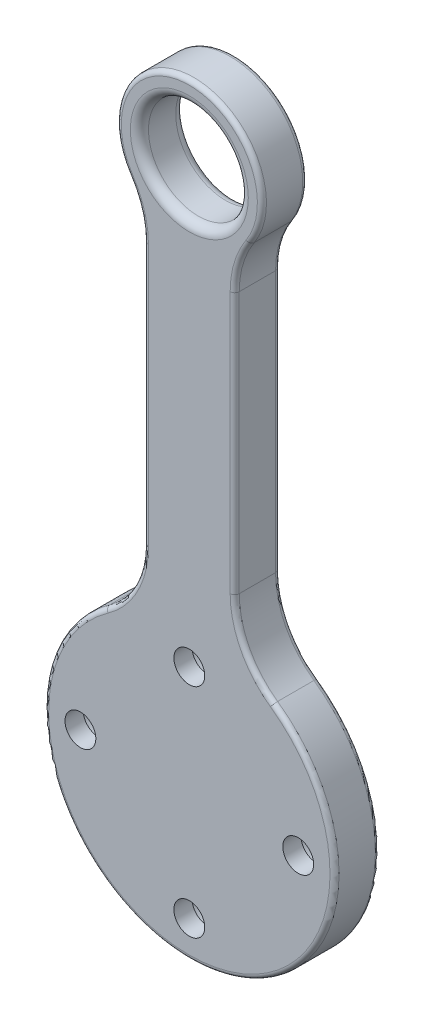
ISO-10303-21;
HEADER;
FILE_DESCRIPTION(('STEP AP214'),'2;1');
FILE_NAME('part.step','',(''),(''),'','','');
FILE_SCHEMA(('AUTOMOTIVE_DESIGN { 1 0 10303 214 1 1 1 1 }'));
ENDSEC;
DATA;
#1=APPLICATION_CONTEXT('core data for automotive mechanical design processes');
#2=APPLICATION_PROTOCOL_DEFINITION('international standard','automotive_design',2000,#1);
#3=PRODUCT_CONTEXT('',#1,'mechanical');
#4=PRODUCT('Part','Part','',(#3));
#5=PRODUCT_RELATED_PRODUCT_CATEGORY('part','',(#4));
#6=PRODUCT_DEFINITION_FORMATION('','',#4);
#7=PRODUCT_DEFINITION_CONTEXT('part definition',#1,'design');
#8=PRODUCT_DEFINITION('design','',#6,#7);
#9=PRODUCT_DEFINITION_SHAPE('','',#8);
#10=(LENGTH_UNIT() NAMED_UNIT(*) SI_UNIT(.MILLI.,.METRE.));
#11=(NAMED_UNIT(*) PLANE_ANGLE_UNIT() SI_UNIT($,.RADIAN.));
#12=(NAMED_UNIT(*) SI_UNIT($,.STERADIAN.) SOLID_ANGLE_UNIT());
#13=UNCERTAINTY_MEASURE_WITH_UNIT(LENGTH_MEASURE(1.E-05),#10,'distance_accuracy_value','');
#14=(GEOMETRIC_REPRESENTATION_CONTEXT(3) GLOBAL_UNCERTAINTY_ASSIGNED_CONTEXT((#13)) GLOBAL_UNIT_ASSIGNED_CONTEXT((#10,
#11,#12)) REPRESENTATION_CONTEXT('',''));
#15=CARTESIAN_POINT('',(0.,0.,0.));
#16=DIRECTION('',(0.,0.,1.));
#17=DIRECTION('',(1.,0.,0.));
#18=AXIS2_PLACEMENT_3D('',#15,#16,#17);
#19=CARTESIAN_POINT('',(0.,60.,0.));
#20=DIRECTION('',(0.,0.,1.));
#21=DIRECTION('',(1.,0.,0.));
#22=AXIS2_PLACEMENT_3D('',#19,#20,#21);
#23=CYLINDRICAL_SURFACE('',#22,8.);
#24=DIRECTION('',(0.,0.,1.));
#25=VECTOR('',#24,1.);
#26=CARTESIAN_POINT('',(6.66666666666667,55.5778336128595,0.));
#27=LINE('',#26,#25);
#28=CARTESIAN_POINT('',(6.66666666666667,55.5778336128595,4.5));
#29=VERTEX_POINT('',#28);
#30=CARTESIAN_POINT('',(6.66666666666667,55.5778336128595,0.5));
#31=VERTEX_POINT('',#30);
#32=EDGE_CURVE('E340',#29,#31,#27,.F.);
#33=ORIENTED_EDGE('',*,*,#32,.T.);
#34=CARTESIAN_POINT('',(0.,60.,0.5));
#35=DIRECTION('',(0.,0.,1.));
#36=DIRECTION('',(1.,0.,0.));
#37=AXIS2_PLACEMENT_3D('',#34,#35,#36);
#38=CIRCLE('',#37,8.);
#39=CARTESIAN_POINT('',(-6.66666666666667,55.5778336128595,0.5));
#40=VERTEX_POINT('',#39);
#41=EDGE_CURVE('E216',#31,#40,#38,.T.);
#42=ORIENTED_EDGE('',*,*,#41,.T.);
#43=DIRECTION('',(0.,0.,1.));
#44=VECTOR('',#43,1.);
#45=CARTESIAN_POINT('',(-6.66666666666667,55.5778336128595,0.));
#46=LINE('',#45,#44);
#47=CARTESIAN_POINT('',(-6.66666666666667,55.5778336128595,4.5));
#48=VERTEX_POINT('',#47);
#49=EDGE_CURVE('E330',#40,#48,#46,.T.);
#50=ORIENTED_EDGE('',*,*,#49,.T.);
#51=CARTESIAN_POINT('',(0.,60.,4.5));
#52=DIRECTION('',(0.,0.,1.));
#53=DIRECTION('',(1.,0.,0.));
#54=AXIS2_PLACEMENT_3D('',#51,#52,#53);
#55=CIRCLE('',#54,8.);
#56=EDGE_CURVE('E213',#48,#29,#55,.F.);
#57=ORIENTED_EDGE('',*,*,#56,.T.);
#58=EDGE_LOOP('',(#33,#42,#50,#57));
#59=FACE_BOUND('',#58,.T.);
#60=ADVANCED_FACE('F42',(#59),#23,.T.);
#61=CARTESIAN_POINT('',(5.,13.076696830622,0.));
#62=DIRECTION('',(1.,0.,0.));
#63=DIRECTION('',(0.,1.,0.));
#64=AXIS2_PLACEMENT_3D('',#61,#62,#63);
#65=PLANE('',#64);
#66=DIRECTION('',(0.,0.,1.));
#67=VECTOR('',#66,1.);
#68=CARTESIAN_POINT('',(5.,21.2367605815953,0.));
#69=LINE('',#68,#67);
#70=CARTESIAN_POINT('',(5.,21.2367605815953,4.5));
#71=VERTEX_POINT('',#70);
#72=CARTESIAN_POINT('',(5.,21.2367605815953,0.5));
#73=VERTEX_POINT('',#72);
#74=EDGE_CURVE('E390',#71,#73,#69,.F.);
#75=ORIENTED_EDGE('',*,*,#74,.T.);
#76=DIRECTION('',(0.,1.,0.));
#77=VECTOR('',#76,1.);
#78=CARTESIAN_POINT('',(5.,50.0501256289338,0.5));
#79=LINE('',#78,#77);
#80=CARTESIAN_POINT('',(5.,50.0501256289338,0.5));
#81=VERTEX_POINT('',#80);
#82=EDGE_CURVE('E204',#73,#81,#79,.T.);
#83=ORIENTED_EDGE('',*,*,#82,.T.);
#84=DIRECTION('',(0.,0.,-1.));
#85=VECTOR('',#84,1.);
#86=CARTESIAN_POINT('',(5.,50.0501256289338,5.));
#87=LINE('',#86,#85);
#88=CARTESIAN_POINT('',(5.,50.0501256289338,4.5));
#89=VERTEX_POINT('',#88);
#90=EDGE_CURVE('E396',#81,#89,#87,.F.);
#91=ORIENTED_EDGE('',*,*,#90,.T.);
#92=DIRECTION('',(0.,1.,0.));
#93=VECTOR('',#92,1.);
#94=CARTESIAN_POINT('',(5.,13.076696830622,4.5));
#95=LINE('',#94,#93);
#96=EDGE_CURVE('E201',#89,#71,#95,.F.);
#97=ORIENTED_EDGE('',*,*,#96,.T.);
#98=EDGE_LOOP('',(#75,#83,#91,#97));
#99=FACE_BOUND('',#98,.T.);
#100=ADVANCED_FACE('F393',(#99),#65,.T.);
#101=CARTESIAN_POINT('',(-5.,53.7550020016016,0.));
#102=DIRECTION('',(-1.,0.,0.));
#103=DIRECTION('',(0.,-1.,0.));
#104=AXIS2_PLACEMENT_3D('',#101,#102,#103);
#105=PLANE('',#104);
#106=DIRECTION('',(0.,0.,-1.));
#107=VECTOR('',#106,1.);
#108=CARTESIAN_POINT('',(-5.,50.0501256289338,0.));
#109=LINE('',#108,#107);
#110=CARTESIAN_POINT('',(-5.,50.0501256289338,4.5));
#111=VERTEX_POINT('',#110);
#112=CARTESIAN_POINT('',(-5.,50.0501256289338,0.5));
#113=VERTEX_POINT('',#112);
#114=EDGE_CURVE('E333',#111,#113,#109,.T.);
#115=ORIENTED_EDGE('',*,*,#114,.T.);
#116=DIRECTION('',(0.,-1.,0.));
#117=VECTOR('',#116,1.);
#118=CARTESIAN_POINT('',(-5.,21.2367605815953,0.5));
#119=LINE('',#118,#117);
#120=CARTESIAN_POINT('',(-5.,21.2367605815953,0.5));
#121=VERTEX_POINT('',#120);
#122=EDGE_CURVE('E228',#113,#121,#119,.T.);
#123=ORIENTED_EDGE('',*,*,#122,.T.);
#124=DIRECTION('',(0.,0.,1.));
#125=VECTOR('',#124,1.);
#126=CARTESIAN_POINT('',(-5.,21.2367605815953,5.));
#127=LINE('',#126,#125);
#128=CARTESIAN_POINT('',(-5.,21.2367605815953,4.5));
#129=VERTEX_POINT('',#128);
#130=EDGE_CURVE('E347',#121,#129,#127,.T.);
#131=ORIENTED_EDGE('',*,*,#130,.T.);
#132=DIRECTION('',(0.,-1.,0.));
#133=VECTOR('',#132,1.);
#134=CARTESIAN_POINT('',(-5.,53.7550020016016,4.5));
#135=LINE('',#134,#133);
#136=EDGE_CURVE('E225',#129,#111,#135,.F.);
#137=ORIENTED_EDGE('',*,*,#136,.T.);
#138=EDGE_LOOP('',(#115,#123,#131,#137));
#139=FACE_BOUND('',#138,.T.);
#140=ADVANCED_FACE('F407',(#139),#105,.T.);
#141=CARTESIAN_POINT('',(0.,60.,0.));
#142=DIRECTION('',(0.,0.,1.));
#143=DIRECTION('',(1.,0.,0.));
#144=AXIS2_PLACEMENT_3D('',#141,#142,#143);
#145=PLANE('',#144);
#146=DIRECTION('',(0.,1.,0.));
#147=VECTOR('',#146,1.);
#148=CARTESIAN_POINT('',(4.5,21.2367605815953,0.));
#149=LINE('',#148,#147);
#150=CARTESIAN_POINT('',(4.5,50.0501256289338,0.));
#151=VERTEX_POINT('',#150);
#152=CARTESIAN_POINT('',(4.5,21.2367605815953,0.));
#153=VERTEX_POINT('',#152);
#154=EDGE_CURVE('E186',#151,#153,#149,.F.);
#155=ORIENTED_EDGE('',*,*,#154,.T.);
#156=CARTESIAN_POINT('',(15.,21.2367605815953,0.));
#157=DIRECTION('',(0.,0.,1.));
#158=DIRECTION('',(1.,0.,0.));
#159=AXIS2_PLACEMENT_3D('',#156,#157,#158);
#160=CIRCLE('',#159,10.5);
#161=CARTESIAN_POINT('',(8.94230769230769,12.6603765005664,0.));
#162=VERTEX_POINT('',#161);
#163=EDGE_CURVE('E164',#153,#162,#160,.T.);
#164=ORIENTED_EDGE('',*,*,#163,.T.);
#165=CARTESIAN_POINT('',(0.,0.,0.));
#166=DIRECTION('',(0.,0.,1.));
#167=DIRECTION('',(1.,0.,0.));
#168=AXIS2_PLACEMENT_3D('',#165,#166,#167);
#169=CIRCLE('',#168,15.5);
#170=CARTESIAN_POINT('',(-8.94230769230769,12.6603765005664,0.));
#171=VERTEX_POINT('',#170);
#172=EDGE_CURVE('E173',#162,#171,#169,.F.);
#173=ORIENTED_EDGE('',*,*,#172,.T.);
#174=CARTESIAN_POINT('',(-15.,21.2367605815953,0.));
#175=DIRECTION('',(0.,0.,1.));
#176=DIRECTION('',(1.,0.,0.));
#177=AXIS2_PLACEMENT_3D('',#174,#175,#176);
#178=CIRCLE('',#177,10.5);
#179=CARTESIAN_POINT('',(-4.5,21.2367605815953,0.));
#180=VERTEX_POINT('',#179);
#181=EDGE_CURVE('E180',#171,#180,#178,.T.);
#182=ORIENTED_EDGE('',*,*,#181,.T.);
#183=DIRECTION('',(0.,-1.,0.));
#184=VECTOR('',#183,1.);
#185=CARTESIAN_POINT('',(-4.5,50.0501256289338,0.));
#186=LINE('',#185,#184);
#187=CARTESIAN_POINT('',(-4.5,50.0501256289338,0.));
#188=VERTEX_POINT('',#187);
#189=EDGE_CURVE('E363',#180,#188,#186,.F.);
#190=ORIENTED_EDGE('',*,*,#189,.T.);
#191=CARTESIAN_POINT('',(-15.,50.0501256289338,0.));
#192=DIRECTION('',(0.,0.,1.));
#193=DIRECTION('',(1.,0.,0.));
#194=AXIS2_PLACEMENT_3D('',#191,#192,#193);
#195=CIRCLE('',#194,10.5);
#196=CARTESIAN_POINT('',(-6.25,55.8542190120558,0.));
#197=VERTEX_POINT('',#196);
#198=EDGE_CURVE('E366',#188,#197,#195,.T.);
#199=ORIENTED_EDGE('',*,*,#198,.T.);
#200=CARTESIAN_POINT('',(0.,60.,0.));
#201=DIRECTION('',(0.,0.,1.));
#202=DIRECTION('',(1.,0.,0.));
#203=AXIS2_PLACEMENT_3D('',#200,#201,#202);
#204=CIRCLE('',#203,7.5);
#205=CARTESIAN_POINT('',(6.25,55.8542190120558,0.));
#206=VERTEX_POINT('',#205);
#207=EDGE_CURVE('E369',#197,#206,#204,.F.);
#208=ORIENTED_EDGE('',*,*,#207,.T.);
#209=CARTESIAN_POINT('',(15.,50.0501256289338,0.));
#210=DIRECTION('',(0.,0.,1.));
#211=DIRECTION('',(1.,0.,0.));
#212=AXIS2_PLACEMENT_3D('',#209,#210,#211);
#213=CIRCLE('',#212,10.5);
#214=EDGE_CURVE('E195',#206,#151,#213,.T.);
#215=ORIENTED_EDGE('',*,*,#214,.T.);
#216=EDGE_LOOP('',(#155,#164,#173,#182,#190,#199,#208,#215));
#217=FACE_BOUND('',#216,.T.);
#218=CARTESIAN_POINT('',(0.,60.,0.));
#219=DIRECTION('',(0.,0.,1.));
#220=DIRECTION('',(1.,0.,0.));
#221=AXIS2_PLACEMENT_3D('',#218,#219,#220);
#222=CIRCLE('',#221,6.5);
#223=CARTESIAN_POINT('',(6.5,60.,0.));
#224=VERTEX_POINT('',#223);
#225=EDGE_CURVE('E181',#224,#224,#222,.T.);
#226=ORIENTED_EDGE('',*,*,#225,.T.);
#227=EDGE_LOOP('',(#226));
#228=FACE_BOUND('',#227,.T.);
#229=CARTESIAN_POINT('',(0.,12.,0.));
#230=DIRECTION('',(0.,0.,-1.));
#231=DIRECTION('',(-1.,0.,0.));
#232=AXIS2_PLACEMENT_3D('',#229,#230,#231);
#233=CIRCLE('',#232,3.25);
#234=CARTESIAN_POINT('',(-3.25,12.,0.));
#235=VERTEX_POINT('',#234);
#236=EDGE_CURVE('E286',#235,#235,#233,.T.);
#237=ORIENTED_EDGE('',*,*,#236,.F.);
#238=EDGE_LOOP('',(#237));
#239=FACE_BOUND('',#238,.T.);
#240=CARTESIAN_POINT('',(-12.,0.,0.));
#241=DIRECTION('',(0.,0.,-1.));
#242=DIRECTION('',(-1.,0.,0.));
#243=AXIS2_PLACEMENT_3D('',#240,#241,#242);
#244=CIRCLE('',#243,3.25);
#245=CARTESIAN_POINT('',(-15.25,0.,0.));
#246=VERTEX_POINT('',#245);
#247=EDGE_CURVE('E473',#246,#246,#244,.T.);
#248=ORIENTED_EDGE('',*,*,#247,.F.);
#249=EDGE_LOOP('',(#248));
#250=FACE_BOUND('',#249,.T.);
#251=CARTESIAN_POINT('',(12.,0.,0.));
#252=DIRECTION('',(0.,0.,-1.));
#253=DIRECTION('',(-1.,0.,0.));
#254=AXIS2_PLACEMENT_3D('',#251,#252,#253);
#255=CIRCLE('',#254,3.25);
#256=CARTESIAN_POINT('',(8.75,0.,0.));
#257=VERTEX_POINT('',#256);
#258=EDGE_CURVE('E457',#257,#257,#255,.T.);
#259=ORIENTED_EDGE('',*,*,#258,.F.);
#260=EDGE_LOOP('',(#259));
#261=FACE_BOUND('',#260,.T.);
#262=CARTESIAN_POINT('',(0.,-12.,0.));
#263=DIRECTION('',(0.,0.,-1.));
#264=DIRECTION('',(-1.,0.,0.));
#265=AXIS2_PLACEMENT_3D('',#262,#263,#264);
#266=CIRCLE('',#265,3.25);
#267=CARTESIAN_POINT('',(-3.25,-12.,0.));
#268=VERTEX_POINT('',#267);
#269=EDGE_CURVE('E441',#268,#268,#266,.T.);
#270=ORIENTED_EDGE('',*,*,#269,.F.);
#271=EDGE_LOOP('',(#270));
#272=FACE_BOUND('',#271,.T.);
#273=ADVANCED_FACE('F183',(#217,#228,#239,#250,#261,#272),#145,.F.);
#274=CARTESIAN_POINT('',(0.,60.,5.));
#275=DIRECTION('',(0.,0.,1.));
#276=DIRECTION('',(1.,0.,0.));
#277=AXIS2_PLACEMENT_3D('',#274,#275,#276);
#278=PLANE('',#277);
#279=CARTESIAN_POINT('',(0.,0.,5.));
#280=DIRECTION('',(0.,0.,1.));
#281=DIRECTION('',(1.,0.,0.));
#282=AXIS2_PLACEMENT_3D('',#279,#280,#281);
#283=CIRCLE('',#282,15.5);
#284=CARTESIAN_POINT('',(-8.94230769230769,12.6603765005664,5.));
#285=VERTEX_POINT('',#284);
#286=CARTESIAN_POINT('',(8.94230769230769,12.6603765005664,5.));
#287=VERTEX_POINT('',#286);
#288=EDGE_CURVE('E237',#285,#287,#283,.T.);
#289=ORIENTED_EDGE('',*,*,#288,.T.);
#290=CARTESIAN_POINT('',(15.,21.2367605815953,5.));
#291=DIRECTION('',(0.,0.,1.));
#292=DIRECTION('',(1.,0.,0.));
#293=AXIS2_PLACEMENT_3D('',#290,#291,#292);
#294=CIRCLE('',#293,10.5);
#295=CARTESIAN_POINT('',(4.5,21.2367605815953,5.));
#296=VERTEX_POINT('',#295);
#297=EDGE_CURVE('E257',#287,#296,#294,.F.);
#298=ORIENTED_EDGE('',*,*,#297,.T.);
#299=DIRECTION('',(0.,1.,0.));
#300=VECTOR('',#299,1.);
#301=CARTESIAN_POINT('',(4.5,60.,5.));
#302=LINE('',#301,#300);
#303=CARTESIAN_POINT('',(4.5,50.0501256289338,5.));
#304=VERTEX_POINT('',#303);
#305=EDGE_CURVE('E67',#296,#304,#302,.T.);
#306=ORIENTED_EDGE('',*,*,#305,.T.);
#307=CARTESIAN_POINT('',(15.,50.0501256289338,5.));
#308=DIRECTION('',(0.,0.,1.));
#309=DIRECTION('',(1.,0.,0.));
#310=AXIS2_PLACEMENT_3D('',#307,#308,#309);
#311=CIRCLE('',#310,10.5);
#312=CARTESIAN_POINT('',(6.25,55.8542190120558,5.));
#313=VERTEX_POINT('',#312);
#314=EDGE_CURVE('E252',#304,#313,#311,.F.);
#315=ORIENTED_EDGE('',*,*,#314,.T.);
#316=CARTESIAN_POINT('',(0.,60.,5.));
#317=DIRECTION('',(0.,0.,1.));
#318=DIRECTION('',(1.,0.,0.));
#319=AXIS2_PLACEMENT_3D('',#316,#317,#318);
#320=CIRCLE('',#319,7.5);
#321=CARTESIAN_POINT('',(-6.25,55.8542190120558,5.));
#322=VERTEX_POINT('',#321);
#323=EDGE_CURVE('E249',#313,#322,#320,.T.);
#324=ORIENTED_EDGE('',*,*,#323,.T.);
#325=CARTESIAN_POINT('',(-15.,50.0501256289338,5.));
#326=DIRECTION('',(0.,0.,1.));
#327=DIRECTION('',(1.,0.,0.));
#328=AXIS2_PLACEMENT_3D('',#325,#326,#327);
#329=CIRCLE('',#328,10.5);
#330=CARTESIAN_POINT('',(-4.5,50.0501256289338,5.));
#331=VERTEX_POINT('',#330);
#332=EDGE_CURVE('E246',#322,#331,#329,.F.);
#333=ORIENTED_EDGE('',*,*,#332,.T.);
#334=DIRECTION('',(0.,-1.,0.));
#335=VECTOR('',#334,1.);
#336=CARTESIAN_POINT('',(-4.5,60.,5.));
#337=LINE('',#336,#335);
#338=CARTESIAN_POINT('',(-4.5,21.2367605815953,5.));
#339=VERTEX_POINT('',#338);
#340=EDGE_CURVE('E243',#331,#339,#337,.T.);
#341=ORIENTED_EDGE('',*,*,#340,.T.);
#342=CARTESIAN_POINT('',(-15.,21.2367605815953,5.));
#343=DIRECTION('',(0.,0.,1.));
#344=DIRECTION('',(1.,0.,0.));
#345=AXIS2_PLACEMENT_3D('',#342,#343,#344);
#346=CIRCLE('',#345,10.5);
#347=EDGE_CURVE('E240',#339,#285,#346,.F.);
#348=ORIENTED_EDGE('',*,*,#347,.T.);
#349=EDGE_LOOP('',(#289,#298,#306,#315,#324,#333,#341,#348));
#350=FACE_BOUND('',#349,.T.);
#351=CARTESIAN_POINT('',(0.,60.,5.));
#352=DIRECTION('',(0.,0.,1.));
#353=DIRECTION('',(1.,0.,0.));
#354=AXIS2_PLACEMENT_3D('',#351,#352,#353);
#355=CIRCLE('',#354,6.5);
#356=CARTESIAN_POINT('',(6.5,60.,5.));
#357=VERTEX_POINT('',#356);
#358=EDGE_CURVE('E339',#357,#357,#355,.F.);
#359=ORIENTED_EDGE('',*,*,#358,.T.);
#360=EDGE_LOOP('',(#359));
#361=FACE_BOUND('',#360,.T.);
#362=CARTESIAN_POINT('',(0.,12.,5.));
#363=DIRECTION('',(0.,0.,-1.));
#364=DIRECTION('',(-1.,0.,0.));
#365=AXIS2_PLACEMENT_3D('',#362,#363,#364);
#366=CIRCLE('',#365,1.70000000000001);
#367=CARTESIAN_POINT('',(-1.70000000000001,12.,5.));
#368=VERTEX_POINT('',#367);
#369=EDGE_CURVE('E477',#368,#368,#366,.T.);
#370=ORIENTED_EDGE('',*,*,#369,.T.);
#371=EDGE_LOOP('',(#370));
#372=FACE_BOUND('',#371,.T.);
#373=CARTESIAN_POINT('',(-12.,0.,5.));
#374=DIRECTION('',(0.,0.,-1.));
#375=DIRECTION('',(-1.,0.,0.));
#376=AXIS2_PLACEMENT_3D('',#373,#374,#375);
#377=CIRCLE('',#376,1.70000000000001);
#378=CARTESIAN_POINT('',(-13.7,0.,5.));
#379=VERTEX_POINT('',#378);
#380=EDGE_CURVE('E461',#379,#379,#377,.T.);
#381=ORIENTED_EDGE('',*,*,#380,.T.);
#382=EDGE_LOOP('',(#381));
#383=FACE_BOUND('',#382,.T.);
#384=CARTESIAN_POINT('',(12.,0.,5.));
#385=DIRECTION('',(0.,0.,-1.));
#386=DIRECTION('',(-1.,0.,0.));
#387=AXIS2_PLACEMENT_3D('',#384,#385,#386);
#388=CIRCLE('',#387,1.70000000000001);
#389=CARTESIAN_POINT('',(10.3,0.,5.));
#390=VERTEX_POINT('',#389);
#391=EDGE_CURVE('E445',#390,#390,#388,.T.);
#392=ORIENTED_EDGE('',*,*,#391,.T.);
#393=EDGE_LOOP('',(#392));
#394=FACE_BOUND('',#393,.T.);
#395=CARTESIAN_POINT('',(0.,-12.,5.));
#396=DIRECTION('',(0.,0.,-1.));
#397=DIRECTION('',(-1.,0.,0.));
#398=AXIS2_PLACEMENT_3D('',#395,#396,#397);
#399=CIRCLE('',#398,1.70000000000001);
#400=CARTESIAN_POINT('',(-1.70000000000001,-12.,5.));
#401=VERTEX_POINT('',#400);
#402=EDGE_CURVE('E426',#401,#401,#399,.T.);
#403=ORIENTED_EDGE('',*,*,#402,.T.);
#404=EDGE_LOOP('',(#403));
#405=FACE_BOUND('',#404,.T.);
#406=ADVANCED_FACE('F497',(#350,#361,#372,#383,#394,#405),#278,.T.);
#407=CARTESIAN_POINT('',(0.,0.,5.));
#408=DIRECTION('',(0.,0.,-1.));
#409=DIRECTION('',(-1.,0.,0.));
#410=AXIS2_PLACEMENT_3D('',#407,#408,#409);
#411=CYLINDRICAL_SURFACE('',#410,16.);
#412=DIRECTION('',(0.,0.,-1.));
#413=VECTOR('',#412,1.);
#414=CARTESIAN_POINT('',(-9.23076923076923,13.0687757425202,5.));
#415=LINE('',#414,#413);
#416=CARTESIAN_POINT('',(-9.23076923076923,13.0687757425202,4.5));
#417=VERTEX_POINT('',#416);
#418=CARTESIAN_POINT('',(-9.23076923076923,13.0687757425202,0.5));
#419=VERTEX_POINT('',#418);
#420=EDGE_CURVE('E423',#417,#419,#415,.T.);
#421=ORIENTED_EDGE('',*,*,#420,.T.);
#422=CARTESIAN_POINT('',(0.,0.,0.5));
#423=DIRECTION('',(0.,0.,1.));
#424=DIRECTION('',(1.,0.,0.));
#425=AXIS2_PLACEMENT_3D('',#422,#423,#424);
#426=CIRCLE('',#425,16.);
#427=CARTESIAN_POINT('',(9.23076923076923,13.0687757425202,0.5));
#428=VERTEX_POINT('',#427);
#429=EDGE_CURVE('E11',#419,#428,#426,.T.);
#430=ORIENTED_EDGE('',*,*,#429,.T.);
#431=DIRECTION('',(0.,0.,-1.));
#432=VECTOR('',#431,1.);
#433=CARTESIAN_POINT('',(9.23076923076923,13.0687757425202,5.));
#434=LINE('',#433,#432);
#435=CARTESIAN_POINT('',(9.23076923076923,13.0687757425202,4.5));
#436=VERTEX_POINT('',#435);
#437=EDGE_CURVE('E392',#428,#436,#434,.F.);
#438=ORIENTED_EDGE('',*,*,#437,.T.);
#439=CARTESIAN_POINT('',(0.,0.,4.5));
#440=DIRECTION('',(0.,0.,1.));
#441=DIRECTION('',(1.,0.,0.));
#442=AXIS2_PLACEMENT_3D('',#439,#440,#441);
#443=CIRCLE('',#442,16.);
#444=EDGE_CURVE('E52',#436,#417,#443,.F.);
#445=ORIENTED_EDGE('',*,*,#444,.T.);
#446=EDGE_LOOP('',(#421,#430,#438,#445));
#447=FACE_BOUND('',#446,.T.);
#448=ADVANCED_FACE('F422',(#447),#411,.T.);
#449=CARTESIAN_POINT('',(0.,-12.,0.));
#450=DIRECTION('',(0.,0.,-1.));
#451=DIRECTION('',(-1.,0.,0.));
#452=AXIS2_PLACEMENT_3D('',#449,#450,#451);
#453=CYLINDRICAL_SURFACE('',#452,1.70000000000001);
#454=ORIENTED_EDGE('',*,*,#402,.F.);
#455=EDGE_LOOP('',(#454));
#456=FACE_BOUND('',#455,.T.);
#457=CARTESIAN_POINT('',(0.,-12.,3.));
#458=DIRECTION('',(0.,0.,-1.));
#459=DIRECTION('',(-1.,0.,0.));
#460=AXIS2_PLACEMENT_3D('',#457,#458,#459);
#461=CIRCLE('',#460,1.70000000000001);
#462=CARTESIAN_POINT('',(-1.70000000000001,-12.,3.));
#463=VERTEX_POINT('',#462);
#464=EDGE_CURVE('E431',#463,#463,#461,.T.);
#465=ORIENTED_EDGE('',*,*,#464,.T.);
#466=EDGE_LOOP('',(#465));
#467=FACE_BOUND('',#466,.T.);
#468=ADVANCED_FACE('F518',(#456,#467),#453,.F.);
#469=CARTESIAN_POINT('',(1.70000000000001,-12.,3.));
#470=DIRECTION('',(0.,0.,1.));
#471=DIRECTION('',(1.,0.,0.));
#472=AXIS2_PLACEMENT_3D('',#469,#470,#471);
#473=PLANE('',#472);
#474=ORIENTED_EDGE('',*,*,#464,.F.);
#475=EDGE_LOOP('',(#474));
#476=FACE_BOUND('',#475,.T.);
#477=CARTESIAN_POINT('',(0.,-12.,3.));
#478=DIRECTION('',(0.,0.,-1.));
#479=DIRECTION('',(-1.,0.,0.));
#480=AXIS2_PLACEMENT_3D('',#477,#478,#479);
#481=CIRCLE('',#480,3.25);
#482=CARTESIAN_POINT('',(-3.25,-12.,3.));
#483=VERTEX_POINT('',#482);
#484=EDGE_CURVE('E437',#483,#483,#481,.T.);
#485=ORIENTED_EDGE('',*,*,#484,.T.);
#486=EDGE_LOOP('',(#485));
#487=FACE_BOUND('',#486,.T.);
#488=ADVANCED_FACE('F508',(#476,#487),#473,.F.);
#489=CARTESIAN_POINT('',(0.,-12.,0.));
#490=DIRECTION('',(0.,0.,-1.));
#491=DIRECTION('',(-1.,0.,0.));
#492=AXIS2_PLACEMENT_3D('',#489,#490,#491);
#493=CYLINDRICAL_SURFACE('',#492,3.25);
#494=ORIENTED_EDGE('',*,*,#484,.F.);
#495=EDGE_LOOP('',(#494));
#496=FACE_BOUND('',#495,.T.);
#497=ORIENTED_EDGE('',*,*,#269,.T.);
#498=EDGE_LOOP('',(#497));
#499=FACE_BOUND('',#498,.T.);
#500=ADVANCED_FACE('F505',(#496,#499),#493,.F.);
#501=CARTESIAN_POINT('',(12.,0.,0.));
#502=DIRECTION('',(0.,0.,-1.));
#503=DIRECTION('',(-1.,0.,0.));
#504=AXIS2_PLACEMENT_3D('',#501,#502,#503);
#505=CYLINDRICAL_SURFACE('',#504,1.70000000000001);
#506=ORIENTED_EDGE('',*,*,#391,.F.);
#507=EDGE_LOOP('',(#506));
#508=FACE_BOUND('',#507,.T.);
#509=CARTESIAN_POINT('',(12.,0.,3.));
#510=DIRECTION('',(0.,0.,-1.));
#511=DIRECTION('',(-1.,0.,0.));
#512=AXIS2_PLACEMENT_3D('',#509,#510,#511);
#513=CIRCLE('',#512,1.70000000000001);
#514=CARTESIAN_POINT('',(10.3,0.,3.));
#515=VERTEX_POINT('',#514);
#516=EDGE_CURVE('E449',#515,#515,#513,.T.);
#517=ORIENTED_EDGE('',*,*,#516,.T.);
#518=EDGE_LOOP('',(#517));
#519=FACE_BOUND('',#518,.T.);
#520=ADVANCED_FACE('F507',(#508,#519),#505,.F.);
#521=CARTESIAN_POINT('',(13.7,0.,3.));
#522=DIRECTION('',(0.,0.,1.));
#523=DIRECTION('',(1.,0.,0.));
#524=AXIS2_PLACEMENT_3D('',#521,#522,#523);
#525=PLANE('',#524);
#526=ORIENTED_EDGE('',*,*,#516,.F.);
#527=EDGE_LOOP('',(#526));
#528=FACE_BOUND('',#527,.T.);
#529=CARTESIAN_POINT('',(12.,0.,3.));
#530=DIRECTION('',(0.,0.,-1.));
#531=DIRECTION('',(-1.,0.,0.));
#532=AXIS2_PLACEMENT_3D('',#529,#530,#531);
#533=CIRCLE('',#532,3.25);
#534=CARTESIAN_POINT('',(8.75,0.,3.));
#535=VERTEX_POINT('',#534);
#536=EDGE_CURVE('E453',#535,#535,#533,.T.);
#537=ORIENTED_EDGE('',*,*,#536,.T.);
#538=EDGE_LOOP('',(#537));
#539=FACE_BOUND('',#538,.T.);
#540=ADVANCED_FACE('F515',(#528,#539),#525,.F.);
#541=CARTESIAN_POINT('',(12.,0.,0.));
#542=DIRECTION('',(0.,0.,-1.));
#543=DIRECTION('',(-1.,0.,0.));
#544=AXIS2_PLACEMENT_3D('',#541,#542,#543);
#545=CYLINDRICAL_SURFACE('',#544,3.25);
#546=ORIENTED_EDGE('',*,*,#536,.F.);
#547=EDGE_LOOP('',(#546));
#548=FACE_BOUND('',#547,.T.);
#549=ORIENTED_EDGE('',*,*,#258,.T.);
#550=EDGE_LOOP('',(#549));
#551=FACE_BOUND('',#550,.T.);
#552=ADVANCED_FACE('F706',(#548,#551),#545,.F.);
#553=CARTESIAN_POINT('',(-12.,0.,0.));
#554=DIRECTION('',(0.,0.,-1.));
#555=DIRECTION('',(-1.,0.,0.));
#556=AXIS2_PLACEMENT_3D('',#553,#554,#555);
#557=CYLINDRICAL_SURFACE('',#556,1.70000000000001);
#558=ORIENTED_EDGE('',*,*,#380,.F.);
#559=EDGE_LOOP('',(#558));
#560=FACE_BOUND('',#559,.T.);
#561=CARTESIAN_POINT('',(-12.,0.,3.));
#562=DIRECTION('',(0.,0.,-1.));
#563=DIRECTION('',(-1.,0.,0.));
#564=AXIS2_PLACEMENT_3D('',#561,#562,#563);
#565=CIRCLE('',#564,1.70000000000001);
#566=CARTESIAN_POINT('',(-13.7,0.,3.));
#567=VERTEX_POINT('',#566);
#568=EDGE_CURVE('E465',#567,#567,#565,.T.);
#569=ORIENTED_EDGE('',*,*,#568,.T.);
#570=EDGE_LOOP('',(#569));
#571=FACE_BOUND('',#570,.T.);
#572=ADVANCED_FACE('F698',(#560,#571),#557,.F.);
#573=CARTESIAN_POINT('',(-10.3,0.,3.));
#574=DIRECTION('',(0.,0.,1.));
#575=DIRECTION('',(1.,0.,0.));
#576=AXIS2_PLACEMENT_3D('',#573,#574,#575);
#577=PLANE('',#576);
#578=ORIENTED_EDGE('',*,*,#568,.F.);
#579=EDGE_LOOP('',(#578));
#580=FACE_BOUND('',#579,.T.);
#581=CARTESIAN_POINT('',(-12.,0.,3.));
#582=DIRECTION('',(0.,0.,-1.));
#583=DIRECTION('',(-1.,0.,0.));
#584=AXIS2_PLACEMENT_3D('',#581,#582,#583);
#585=CIRCLE('',#584,3.25);
#586=CARTESIAN_POINT('',(-15.25,0.,3.));
#587=VERTEX_POINT('',#586);
#588=EDGE_CURVE('E469',#587,#587,#585,.T.);
#589=ORIENTED_EDGE('',*,*,#588,.T.);
#590=EDGE_LOOP('',(#589));
#591=FACE_BOUND('',#590,.T.);
#592=ADVANCED_FACE('F690',(#580,#591),#577,.F.);
#593=CARTESIAN_POINT('',(-12.,0.,0.));
#594=DIRECTION('',(0.,0.,-1.));
#595=DIRECTION('',(-1.,0.,0.));
#596=AXIS2_PLACEMENT_3D('',#593,#594,#595);
#597=CYLINDRICAL_SURFACE('',#596,3.25);
#598=ORIENTED_EDGE('',*,*,#588,.F.);
#599=EDGE_LOOP('',(#598));
#600=FACE_BOUND('',#599,.T.);
#601=ORIENTED_EDGE('',*,*,#247,.T.);
#602=EDGE_LOOP('',(#601));
#603=FACE_BOUND('',#602,.T.);
#604=ADVANCED_FACE('F682',(#600,#603),#597,.F.);
#605=CARTESIAN_POINT('',(0.,12.,0.));
#606=DIRECTION('',(0.,0.,-1.));
#607=DIRECTION('',(-1.,0.,0.));
#608=AXIS2_PLACEMENT_3D('',#605,#606,#607);
#609=CYLINDRICAL_SURFACE('',#608,1.70000000000001);
#610=ORIENTED_EDGE('',*,*,#369,.F.);
#611=EDGE_LOOP('',(#610));
#612=FACE_BOUND('',#611,.T.);
#613=CARTESIAN_POINT('',(0.,12.,3.));
#614=DIRECTION('',(0.,0.,-1.));
#615=DIRECTION('',(-1.,0.,0.));
#616=AXIS2_PLACEMENT_3D('',#613,#614,#615);
#617=CIRCLE('',#616,1.70000000000001);
#618=CARTESIAN_POINT('',(-1.70000000000001,12.,3.));
#619=VERTEX_POINT('',#618);
#620=EDGE_CURVE('E481',#619,#619,#617,.T.);
#621=ORIENTED_EDGE('',*,*,#620,.T.);
#622=EDGE_LOOP('',(#621));
#623=FACE_BOUND('',#622,.T.);
#624=ADVANCED_FACE('F674',(#612,#623),#609,.F.);
#625=CARTESIAN_POINT('',(1.70000000000001,12.,3.));
#626=DIRECTION('',(0.,0.,1.));
#627=DIRECTION('',(1.,0.,0.));
#628=AXIS2_PLACEMENT_3D('',#625,#626,#627);
#629=PLANE('',#628);
#630=ORIENTED_EDGE('',*,*,#620,.F.);
#631=EDGE_LOOP('',(#630));
#632=FACE_BOUND('',#631,.T.);
#633=CARTESIAN_POINT('',(0.,12.,3.));
#634=DIRECTION('',(0.,0.,-1.));
#635=DIRECTION('',(-1.,0.,0.));
#636=AXIS2_PLACEMENT_3D('',#633,#634,#635);
#637=CIRCLE('',#636,3.25);
#638=CARTESIAN_POINT('',(-3.25,12.,3.));
#639=VERTEX_POINT('',#638);
#640=EDGE_CURVE('E485',#639,#639,#637,.T.);
#641=ORIENTED_EDGE('',*,*,#640,.T.);
#642=EDGE_LOOP('',(#641));
#643=FACE_BOUND('',#642,.T.);
#644=ADVANCED_FACE('F666',(#632,#643),#629,.F.);
#645=CARTESIAN_POINT('',(0.,12.,0.));
#646=DIRECTION('',(0.,0.,-1.));
#647=DIRECTION('',(-1.,0.,0.));
#648=AXIS2_PLACEMENT_3D('',#645,#646,#647);
#649=CYLINDRICAL_SURFACE('',#648,3.25);
#650=ORIENTED_EDGE('',*,*,#640,.F.);
#651=EDGE_LOOP('',(#650));
#652=FACE_BOUND('',#651,.T.);
#653=ORIENTED_EDGE('',*,*,#236,.T.);
#654=EDGE_LOOP('',(#653));
#655=FACE_BOUND('',#654,.T.);
#656=ADVANCED_FACE('F493',(#652,#655),#649,.F.);
#657=CARTESIAN_POINT('',(15.,21.2367605815953,5.));
#658=DIRECTION('',(0.,0.,-1.));
#659=DIRECTION('',(-1.,0.,0.));
#660=AXIS2_PLACEMENT_3D('',#657,#658,#659);
#661=CYLINDRICAL_SURFACE('',#660,10.);
#662=ORIENTED_EDGE('',*,*,#437,.F.);
#663=CARTESIAN_POINT('',(15.,21.2367605815953,0.5));
#664=DIRECTION('',(0.,0.,1.));
#665=DIRECTION('',(1.,0.,0.));
#666=AXIS2_PLACEMENT_3D('',#663,#664,#665);
#667=CIRCLE('',#666,10.);
#668=EDGE_CURVE('E166',#428,#73,#667,.F.);
#669=ORIENTED_EDGE('',*,*,#668,.T.);
#670=ORIENTED_EDGE('',*,*,#74,.F.);
#671=CARTESIAN_POINT('',(15.,21.2367605815953,4.5));
#672=DIRECTION('',(0.,0.,1.));
#673=DIRECTION('',(1.,0.,0.));
#674=AXIS2_PLACEMENT_3D('',#671,#672,#673);
#675=CIRCLE('',#674,10.);
#676=EDGE_CURVE('E189',#71,#436,#675,.T.);
#677=ORIENTED_EDGE('',*,*,#676,.T.);
#678=EDGE_LOOP('',(#662,#669,#670,#677));
#679=FACE_BOUND('',#678,.T.);
#680=ADVANCED_FACE('F389',(#679),#661,.F.);
#681=CARTESIAN_POINT('',(-15.,21.2367605815953,5.));
#682=DIRECTION('',(0.,0.,-1.));
#683=DIRECTION('',(-1.,0.,0.));
#684=AXIS2_PLACEMENT_3D('',#681,#682,#683);
#685=CYLINDRICAL_SURFACE('',#684,10.);
#686=ORIENTED_EDGE('',*,*,#130,.F.);
#687=CARTESIAN_POINT('',(-15.,21.2367605815953,0.5));
#688=DIRECTION('',(0.,0.,1.));
#689=DIRECTION('',(1.,0.,0.));
#690=AXIS2_PLACEMENT_3D('',#687,#688,#689);
#691=CIRCLE('',#690,10.);
#692=EDGE_CURVE('E234',#121,#419,#691,.F.);
#693=ORIENTED_EDGE('',*,*,#692,.T.);
#694=ORIENTED_EDGE('',*,*,#420,.F.);
#695=CARTESIAN_POINT('',(-15.,21.2367605815953,4.5));
#696=DIRECTION('',(0.,0.,1.));
#697=DIRECTION('',(1.,0.,0.));
#698=AXIS2_PLACEMENT_3D('',#695,#696,#697);
#699=CIRCLE('',#698,10.);
#700=EDGE_CURVE('E231',#417,#129,#699,.T.);
#701=ORIENTED_EDGE('',*,*,#700,.T.);
#702=EDGE_LOOP('',(#686,#693,#694,#701));
#703=FACE_BOUND('',#702,.T.);
#704=ADVANCED_FACE('F411',(#703),#685,.F.);
#705=CARTESIAN_POINT('',(-15.,50.0501256289338,0.));
#706=DIRECTION('',(0.,0.,1.));
#707=DIRECTION('',(1.,0.,0.));
#708=AXIS2_PLACEMENT_3D('',#705,#706,#707);
#709=CYLINDRICAL_SURFACE('',#708,10.);
#710=ORIENTED_EDGE('',*,*,#49,.F.);
#711=CARTESIAN_POINT('',(-15.,50.0501256289338,0.5));
#712=DIRECTION('',(0.,0.,1.));
#713=DIRECTION('',(1.,0.,0.));
#714=AXIS2_PLACEMENT_3D('',#711,#712,#713);
#715=CIRCLE('',#714,10.);
#716=EDGE_CURVE('E222',#40,#113,#715,.F.);
#717=ORIENTED_EDGE('',*,*,#716,.T.);
#718=ORIENTED_EDGE('',*,*,#114,.F.);
#719=CARTESIAN_POINT('',(-15.,50.0501256289338,4.5));
#720=DIRECTION('',(0.,0.,1.));
#721=DIRECTION('',(1.,0.,0.));
#722=AXIS2_PLACEMENT_3D('',#719,#720,#721);
#723=CIRCLE('',#722,10.);
#724=EDGE_CURVE('E219',#111,#48,#723,.T.);
#725=ORIENTED_EDGE('',*,*,#724,.T.);
#726=EDGE_LOOP('',(#710,#717,#718,#725));
#727=FACE_BOUND('',#726,.T.);
#728=ADVANCED_FACE('F329',(#727),#709,.F.);
#729=CARTESIAN_POINT('',(15.,50.0501256289338,0.));
#730=DIRECTION('',(0.,0.,1.));
#731=DIRECTION('',(1.,0.,0.));
#732=AXIS2_PLACEMENT_3D('',#729,#730,#731);
#733=CYLINDRICAL_SURFACE('',#732,10.);
#734=ORIENTED_EDGE('',*,*,#90,.F.);
#735=CARTESIAN_POINT('',(15.,50.0501256289338,0.5));
#736=DIRECTION('',(0.,0.,1.));
#737=DIRECTION('',(1.,0.,0.));
#738=AXIS2_PLACEMENT_3D('',#735,#736,#737);
#739=CIRCLE('',#738,10.);
#740=EDGE_CURVE('E210',#81,#31,#739,.F.);
#741=ORIENTED_EDGE('',*,*,#740,.T.);
#742=ORIENTED_EDGE('',*,*,#32,.F.);
#743=CARTESIAN_POINT('',(15.,50.0501256289338,4.5));
#744=DIRECTION('',(0.,0.,1.));
#745=DIRECTION('',(1.,0.,0.));
#746=AXIS2_PLACEMENT_3D('',#743,#744,#745);
#747=CIRCLE('',#746,10.);
#748=EDGE_CURVE('E207',#29,#89,#747,.T.);
#749=ORIENTED_EDGE('',*,*,#748,.T.);
#750=EDGE_LOOP('',(#734,#741,#742,#749));
#751=FACE_BOUND('',#750,.T.);
#752=ADVANCED_FACE('F536',(#751),#733,.F.);
#753=CARTESIAN_POINT('',(0.,60.,5.));
#754=DIRECTION('',(0.,0.,-1.));
#755=DIRECTION('',(-1.,0.,0.));
#756=AXIS2_PLACEMENT_3D('',#753,#754,#755);
#757=CYLINDRICAL_SURFACE('',#756,5.5);
#758=CARTESIAN_POINT('',(0.,60.,4.));
#759=DIRECTION('',(0.,0.,1.));
#760=DIRECTION('',(1.,0.,0.));
#761=AXIS2_PLACEMENT_3D('',#758,#759,#760);
#762=CIRCLE('',#761,5.5);
#763=CARTESIAN_POINT('',(5.5,60.,4.));
#764=VERTEX_POINT('',#763);
#765=EDGE_CURVE('E354',#764,#764,#762,.T.);
#766=ORIENTED_EDGE('',*,*,#765,.T.);
#767=EDGE_LOOP('',(#766));
#768=FACE_BOUND('',#767,.T.);
#769=CARTESIAN_POINT('',(0.,60.,1.));
#770=DIRECTION('',(0.,0.,1.));
#771=DIRECTION('',(1.,0.,0.));
#772=AXIS2_PLACEMENT_3D('',#769,#770,#771);
#773=CIRCLE('',#772,5.5);
#774=CARTESIAN_POINT('',(5.5,60.,1.));
#775=VERTEX_POINT('',#774);
#776=EDGE_CURVE('E345',#775,#775,#773,.F.);
#777=ORIENTED_EDGE('',*,*,#776,.T.);
#778=EDGE_LOOP('',(#777));
#779=FACE_BOUND('',#778,.T.);
#780=ADVANCED_FACE('F539',(#768,#779),#757,.F.);
#781=CARTESIAN_POINT('',(0.,60.,4.));
#782=DIRECTION('',(0.,0.,1.));
#783=DIRECTION('',(1.,0.,0.));
#784=AXIS2_PLACEMENT_3D('',#781,#782,#783);
#785=TOROIDAL_SURFACE('',#784,6.5,1.);
#786=ORIENTED_EDGE('',*,*,#765,.F.);
#787=EDGE_LOOP('',(#786));
#788=FACE_BOUND('',#787,.T.);
#789=ORIENTED_EDGE('',*,*,#358,.F.);
#790=EDGE_LOOP('',(#789));
#791=FACE_BOUND('',#790,.T.);
#792=ADVANCED_FACE('F541',(#788,#791),#785,.T.);
#793=CARTESIAN_POINT('',(0.,60.,1.));
#794=DIRECTION('',(0.,0.,1.));
#795=DIRECTION('',(1.,0.,0.));
#796=AXIS2_PLACEMENT_3D('',#793,#794,#795);
#797=TOROIDAL_SURFACE('',#796,6.5,1.);
#798=ORIENTED_EDGE('',*,*,#225,.F.);
#799=EDGE_LOOP('',(#798));
#800=FACE_BOUND('',#799,.T.);
#801=ORIENTED_EDGE('',*,*,#776,.F.);
#802=EDGE_LOOP('',(#801));
#803=FACE_BOUND('',#802,.T.);
#804=ADVANCED_FACE('F544',(#800,#803),#797,.T.);
#805=CARTESIAN_POINT('',(-15.,50.0501256289338,0.5));
#806=DIRECTION('',(0.,0.,1.));
#807=DIRECTION('',(1.,0.,0.));
#808=AXIS2_PLACEMENT_3D('',#805,#806,#807);
#809=TOROIDAL_SURFACE('',#808,10.5,0.5);
#810=CARTESIAN_POINT('',(-4.5,50.0501256289338,0.5));
#811=DIRECTION('',(0.,-1.,0.));
#812=DIRECTION('',(0.,0.,-1.));
#813=AXIS2_PLACEMENT_3D('',#810,#811,#812);
#814=CIRCLE('',#813,0.5);
#815=EDGE_CURVE('E278',#113,#188,#814,.T.);
#816=ORIENTED_EDGE('',*,*,#815,.F.);
#817=ORIENTED_EDGE('',*,*,#716,.F.);
#818=CARTESIAN_POINT('',(-6.25,55.8542190120558,0.5));
#819=DIRECTION('',(-0.552770798392568,0.833333333333332,0.));
#820=DIRECTION('',(-0.833333333333333,-0.552770798392568,0.));
#821=AXIS2_PLACEMENT_3D('',#818,#819,#820);
#822=CIRCLE('',#821,0.5);
#823=EDGE_CURVE('E282',#197,#40,#822,.T.);
#824=ORIENTED_EDGE('',*,*,#823,.F.);
#825=ORIENTED_EDGE('',*,*,#198,.F.);
#826=EDGE_LOOP('',(#816,#817,#824,#825));
#827=FACE_BOUND('',#826,.T.);
#828=ADVANCED_FACE('F548',(#827),#809,.T.);
#829=CARTESIAN_POINT('',(0.,60.,0.5));
#830=DIRECTION('',(0.,0.,1.));
#831=DIRECTION('',(1.,0.,0.));
#832=AXIS2_PLACEMENT_3D('',#829,#830,#831);
#833=TOROIDAL_SURFACE('',#832,7.5,0.5);
#834=ORIENTED_EDGE('',*,*,#823,.T.);
#835=ORIENTED_EDGE('',*,*,#41,.F.);
#836=CARTESIAN_POINT('',(6.25,55.8542190120558,0.5));
#837=DIRECTION('',(-0.552770798392568,-0.833333333333332,0.));
#838=DIRECTION('',(0.833333333333332,-0.552770798392569,0.));
#839=AXIS2_PLACEMENT_3D('',#836,#837,#838);
#840=CIRCLE('',#839,0.5);
#841=EDGE_CURVE('E274',#206,#31,#840,.T.);
#842=ORIENTED_EDGE('',*,*,#841,.F.);
#843=ORIENTED_EDGE('',*,*,#207,.F.);
#844=EDGE_LOOP('',(#834,#835,#842,#843));
#845=FACE_BOUND('',#844,.T.);
#846=ADVANCED_FACE('F562',(#845),#833,.T.);
#847=CARTESIAN_POINT('',(-4.5,53.7550020016016,0.5));
#848=DIRECTION('',(0.,1.,0.));
#849=DIRECTION('',(-1.,0.,0.));
#850=AXIS2_PLACEMENT_3D('',#847,#848,#849);
#851=CYLINDRICAL_SURFACE('',#850,0.5);
#852=ORIENTED_EDGE('',*,*,#815,.T.);
#853=ORIENTED_EDGE('',*,*,#189,.F.);
#854=CARTESIAN_POINT('',(-4.5,21.2367605815953,0.5));
#855=DIRECTION('',(0.,-1.,0.));
#856=DIRECTION('',(0.,0.,-1.));
#857=AXIS2_PLACEMENT_3D('',#854,#855,#856);
#858=CIRCLE('',#857,0.5);
#859=EDGE_CURVE('E270',#121,#180,#858,.T.);
#860=ORIENTED_EDGE('',*,*,#859,.F.);
#861=ORIENTED_EDGE('',*,*,#122,.F.);
#862=EDGE_LOOP('',(#852,#853,#860,#861));
#863=FACE_BOUND('',#862,.T.);
#864=ADVANCED_FACE('F418',(#863),#851,.T.);
#865=CARTESIAN_POINT('',(15.,50.0501256289338,0.5));
#866=DIRECTION('',(0.,0.,1.));
#867=DIRECTION('',(1.,0.,0.));
#868=AXIS2_PLACEMENT_3D('',#865,#866,#867);
#869=TOROIDAL_SURFACE('',#868,10.5,0.5);
#870=ORIENTED_EDGE('',*,*,#841,.T.);
#871=ORIENTED_EDGE('',*,*,#740,.F.);
#872=CARTESIAN_POINT('',(4.5,50.0501256289338,0.5));
#873=DIRECTION('',(0.,-1.,0.));
#874=DIRECTION('',(0.,0.,-1.));
#875=AXIS2_PLACEMENT_3D('',#872,#873,#874);
#876=CIRCLE('',#875,0.5);
#877=EDGE_CURVE('E266',#151,#81,#876,.T.);
#878=ORIENTED_EDGE('',*,*,#877,.F.);
#879=ORIENTED_EDGE('',*,*,#214,.F.);
#880=EDGE_LOOP('',(#870,#871,#878,#879));
#881=FACE_BOUND('',#880,.T.);
#882=ADVANCED_FACE('F378',(#881),#869,.T.);
#883=CARTESIAN_POINT('',(-15.,21.2367605815953,0.5));
#884=DIRECTION('',(0.,0.,1.));
#885=DIRECTION('',(1.,0.,0.));
#886=AXIS2_PLACEMENT_3D('',#883,#884,#885);
#887=TOROIDAL_SURFACE('',#886,10.5,0.5);
#888=ORIENTED_EDGE('',*,*,#859,.T.);
#889=ORIENTED_EDGE('',*,*,#181,.F.);
#890=CARTESIAN_POINT('',(-8.94230769230769,12.6603765005664,0.5));
#891=DIRECTION('',(-0.816798483907512,-0.576923076923076,0.));
#892=DIRECTION('',(0.576923076923076,-0.816798483907512,0.));
#893=AXIS2_PLACEMENT_3D('',#890,#891,#892);
#894=CIRCLE('',#893,0.5);
#895=EDGE_CURVE('E176',#419,#171,#894,.T.);
#896=ORIENTED_EDGE('',*,*,#895,.F.);
#897=ORIENTED_EDGE('',*,*,#692,.F.);
#898=EDGE_LOOP('',(#888,#889,#896,#897));
#899=FACE_BOUND('',#898,.T.);
#900=ADVANCED_FACE('F420',(#899),#887,.T.);
#901=CARTESIAN_POINT('',(4.5,13.076696830622,0.5));
#902=DIRECTION('',(0.,-1.,0.));
#903=DIRECTION('',(1.,0.,0.));
#904=AXIS2_PLACEMENT_3D('',#901,#902,#903);
#905=CYLINDRICAL_SURFACE('',#904,0.5);
#906=ORIENTED_EDGE('',*,*,#877,.T.);
#907=ORIENTED_EDGE('',*,*,#82,.F.);
#908=CARTESIAN_POINT('',(4.5,21.2367605815953,0.5));
#909=DIRECTION('',(0.,-1.,0.));
#910=DIRECTION('',(0.,0.,-1.));
#911=AXIS2_PLACEMENT_3D('',#908,#909,#910);
#912=CIRCLE('',#911,0.5);
#913=EDGE_CURVE('E170',#153,#73,#912,.T.);
#914=ORIENTED_EDGE('',*,*,#913,.F.);
#915=ORIENTED_EDGE('',*,*,#154,.F.);
#916=EDGE_LOOP('',(#906,#907,#914,#915));
#917=FACE_BOUND('',#916,.T.);
#918=ADVANCED_FACE('F381',(#917),#905,.T.);
#919=CARTESIAN_POINT('',(0.,0.,0.5));
#920=DIRECTION('',(0.,0.,1.));
#921=DIRECTION('',(1.,0.,0.));
#922=AXIS2_PLACEMENT_3D('',#919,#920,#921);
#923=TOROIDAL_SURFACE('',#922,15.5,0.5);
#924=ORIENTED_EDGE('',*,*,#895,.T.);
#925=ORIENTED_EDGE('',*,*,#172,.F.);
#926=CARTESIAN_POINT('',(8.94230769230769,12.6603765005664,0.5));
#927=DIRECTION('',(-0.816798483907512,0.576923076923076,0.));
#928=DIRECTION('',(-0.576923076923076,-0.816798483907512,0.));
#929=AXIS2_PLACEMENT_3D('',#926,#927,#928);
#930=CIRCLE('',#929,0.5);
#931=EDGE_CURVE('E160',#428,#162,#930,.T.);
#932=ORIENTED_EDGE('',*,*,#931,.F.);
#933=ORIENTED_EDGE('',*,*,#429,.F.);
#934=EDGE_LOOP('',(#924,#925,#932,#933));
#935=FACE_BOUND('',#934,.T.);
#936=ADVANCED_FACE('F174',(#935),#923,.T.);
#937=CARTESIAN_POINT('',(15.,21.2367605815953,0.5));
#938=DIRECTION('',(0.,0.,1.));
#939=DIRECTION('',(1.,0.,0.));
#940=AXIS2_PLACEMENT_3D('',#937,#938,#939);
#941=TOROIDAL_SURFACE('',#940,10.5,0.5);
#942=ORIENTED_EDGE('',*,*,#913,.T.);
#943=ORIENTED_EDGE('',*,*,#668,.F.);
#944=ORIENTED_EDGE('',*,*,#931,.T.);
#945=ORIENTED_EDGE('',*,*,#163,.F.);
#946=EDGE_LOOP('',(#942,#943,#944,#945));
#947=FACE_BOUND('',#946,.T.);
#948=ADVANCED_FACE('F162',(#947),#941,.T.);
#949=CARTESIAN_POINT('',(-15.,50.0501256289338,4.5));
#950=DIRECTION('',(0.,0.,1.));
#951=DIRECTION('',(1.,0.,0.));
#952=AXIS2_PLACEMENT_3D('',#949,#950,#951);
#953=TOROIDAL_SURFACE('',#952,10.5,0.5);
#954=CARTESIAN_POINT('',(-6.25,55.8542190120558,4.5));
#955=DIRECTION('',(-0.552770798392568,0.833333333333333,0.));
#956=DIRECTION('',(-0.833333333333333,-0.552770798392568,0.));
#957=AXIS2_PLACEMENT_3D('',#954,#955,#956);
#958=CIRCLE('',#957,0.5);
#959=EDGE_CURVE('E307',#48,#322,#958,.T.);
#960=ORIENTED_EDGE('',*,*,#959,.F.);
#961=ORIENTED_EDGE('',*,*,#724,.F.);
#962=CARTESIAN_POINT('',(-4.5,50.0501256289338,4.5));
#963=DIRECTION('',(0.,-1.,0.));
#964=DIRECTION('',(0.,0.,-1.));
#965=AXIS2_PLACEMENT_3D('',#962,#963,#964);
#966=CIRCLE('',#965,0.5);
#967=EDGE_CURVE('E46',#331,#111,#966,.T.);
#968=ORIENTED_EDGE('',*,*,#967,.F.);
#969=ORIENTED_EDGE('',*,*,#332,.F.);
#970=EDGE_LOOP('',(#960,#961,#968,#969));
#971=FACE_BOUND('',#970,.T.);
#972=ADVANCED_FACE('F44',(#971),#953,.T.);
#973=CARTESIAN_POINT('',(-4.5,60.,4.5));
#974=DIRECTION('',(0.,-1.,0.));
#975=DIRECTION('',(1.,0.,0.));
#976=AXIS2_PLACEMENT_3D('',#973,#974,#975);
#977=CYLINDRICAL_SURFACE('',#976,0.5);
#978=ORIENTED_EDGE('',*,*,#967,.T.);
#979=ORIENTED_EDGE('',*,*,#136,.F.);
#980=CARTESIAN_POINT('',(-4.5,21.2367605815953,4.5));
#981=DIRECTION('',(0.,-1.,0.));
#982=DIRECTION('',(0.,0.,-1.));
#983=AXIS2_PLACEMENT_3D('',#980,#981,#982);
#984=CIRCLE('',#983,0.5);
#985=EDGE_CURVE('E304',#339,#129,#984,.T.);
#986=ORIENTED_EDGE('',*,*,#985,.F.);
#987=ORIENTED_EDGE('',*,*,#340,.F.);
#988=EDGE_LOOP('',(#978,#979,#986,#987));
#989=FACE_BOUND('',#988,.T.);
#990=ADVANCED_FACE('F320',(#989),#977,.T.);
#991=CARTESIAN_POINT('',(0.,60.,4.5));
#992=DIRECTION('',(0.,0.,1.));
#993=DIRECTION('',(1.,0.,0.));
#994=AXIS2_PLACEMENT_3D('',#991,#992,#993);
#995=TOROIDAL_SURFACE('',#994,7.5,0.5);
#996=ORIENTED_EDGE('',*,*,#959,.T.);
#997=ORIENTED_EDGE('',*,*,#323,.F.);
#998=CARTESIAN_POINT('',(6.25,55.8542190120558,4.5));
#999=DIRECTION('',(-0.552770798392568,-0.833333333333333,0.));
#1000=DIRECTION('',(0.833333333333333,-0.552770798392568,0.));
#1001=AXIS2_PLACEMENT_3D('',#998,#999,#1000);
#1002=CIRCLE('',#1001,0.5);
#1003=EDGE_CURVE('E300',#29,#313,#1002,.T.);
#1004=ORIENTED_EDGE('',*,*,#1003,.F.);
#1005=ORIENTED_EDGE('',*,*,#56,.F.);
#1006=EDGE_LOOP('',(#996,#997,#1004,#1005));
#1007=FACE_BOUND('',#1006,.T.);
#1008=ADVANCED_FACE('F587',(#1007),#995,.T.);
#1009=CARTESIAN_POINT('',(-15.,21.2367605815953,4.5));
#1010=DIRECTION('',(0.,0.,1.));
#1011=DIRECTION('',(1.,0.,0.));
#1012=AXIS2_PLACEMENT_3D('',#1009,#1010,#1011);
#1013=TOROIDAL_SURFACE('',#1012,10.5,0.5);
#1014=ORIENTED_EDGE('',*,*,#985,.T.);
#1015=ORIENTED_EDGE('',*,*,#700,.F.);
#1016=CARTESIAN_POINT('',(-8.94230769230769,12.6603765005664,4.5));
#1017=DIRECTION('',(-0.816798483907512,-0.576923076923076,0.));
#1018=DIRECTION('',(0.576923076923076,-0.816798483907512,0.));
#1019=AXIS2_PLACEMENT_3D('',#1016,#1017,#1018);
#1020=CIRCLE('',#1019,0.5);
#1021=EDGE_CURVE('E296',#285,#417,#1020,.T.);
#1022=ORIENTED_EDGE('',*,*,#1021,.F.);
#1023=ORIENTED_EDGE('',*,*,#347,.F.);
#1024=EDGE_LOOP('',(#1014,#1015,#1022,#1023));
#1025=FACE_BOUND('',#1024,.T.);
#1026=ADVANCED_FACE('F583',(#1025),#1013,.T.);
#1027=CARTESIAN_POINT('',(15.,50.0501256289338,4.5));
#1028=DIRECTION('',(0.,0.,1.));
#1029=DIRECTION('',(1.,0.,0.));
#1030=AXIS2_PLACEMENT_3D('',#1027,#1028,#1029);
#1031=TOROIDAL_SURFACE('',#1030,10.5,0.5);
#1032=ORIENTED_EDGE('',*,*,#1003,.T.);
#1033=ORIENTED_EDGE('',*,*,#314,.F.);
#1034=CARTESIAN_POINT('',(4.5,50.0501256289338,4.5));
#1035=DIRECTION('',(0.,-1.,0.));
#1036=DIRECTION('',(0.,0.,-1.));
#1037=AXIS2_PLACEMENT_3D('',#1034,#1035,#1036);
#1038=CIRCLE('',#1037,0.5);
#1039=EDGE_CURVE('E292',#89,#304,#1038,.T.);
#1040=ORIENTED_EDGE('',*,*,#1039,.F.);
#1041=ORIENTED_EDGE('',*,*,#748,.F.);
#1042=EDGE_LOOP('',(#1032,#1033,#1040,#1041));
#1043=FACE_BOUND('',#1042,.T.);
#1044=ADVANCED_FACE('F579',(#1043),#1031,.T.);
#1045=CARTESIAN_POINT('',(0.,0.,4.5));
#1046=DIRECTION('',(0.,0.,1.));
#1047=DIRECTION('',(1.,0.,0.));
#1048=AXIS2_PLACEMENT_3D('',#1045,#1046,#1047);
#1049=TOROIDAL_SURFACE('',#1048,15.5,0.5);
#1050=ORIENTED_EDGE('',*,*,#1021,.T.);
#1051=ORIENTED_EDGE('',*,*,#444,.F.);
#1052=CARTESIAN_POINT('',(8.94230769230769,12.6603765005664,4.5));
#1053=DIRECTION('',(-0.816798483907512,0.576923076923076,0.));
#1054=DIRECTION('',(-0.576923076923076,-0.816798483907512,0.));
#1055=AXIS2_PLACEMENT_3D('',#1052,#1053,#1054);
#1056=CIRCLE('',#1055,0.5);
#1057=EDGE_CURVE('E289',#287,#436,#1056,.T.);
#1058=ORIENTED_EDGE('',*,*,#1057,.F.);
#1059=ORIENTED_EDGE('',*,*,#288,.F.);
#1060=EDGE_LOOP('',(#1050,#1051,#1058,#1059));
#1061=FACE_BOUND('',#1060,.T.);
#1062=ADVANCED_FACE('F575',(#1061),#1049,.T.);
#1063=CARTESIAN_POINT('',(4.5,60.,4.5));
#1064=DIRECTION('',(0.,1.,0.));
#1065=DIRECTION('',(-1.,0.,0.));
#1066=AXIS2_PLACEMENT_3D('',#1063,#1064,#1065);
#1067=CYLINDRICAL_SURFACE('',#1066,0.5);
#1068=ORIENTED_EDGE('',*,*,#1039,.T.);
#1069=ORIENTED_EDGE('',*,*,#305,.F.);
#1070=CARTESIAN_POINT('',(4.5,21.2367605815953,4.5));
#1071=DIRECTION('',(0.,-1.,0.));
#1072=DIRECTION('',(0.,0.,-1.));
#1073=AXIS2_PLACEMENT_3D('',#1070,#1071,#1072);
#1074=CIRCLE('',#1073,0.5);
#1075=EDGE_CURVE('E60',#71,#296,#1074,.T.);
#1076=ORIENTED_EDGE('',*,*,#1075,.F.);
#1077=ORIENTED_EDGE('',*,*,#96,.F.);
#1078=EDGE_LOOP('',(#1068,#1069,#1076,#1077));
#1079=FACE_BOUND('',#1078,.T.);
#1080=ADVANCED_FACE('F572',(#1079),#1067,.T.);
#1081=CARTESIAN_POINT('',(15.,21.2367605815953,4.5));
#1082=DIRECTION('',(0.,0.,1.));
#1083=DIRECTION('',(1.,0.,0.));
#1084=AXIS2_PLACEMENT_3D('',#1081,#1082,#1083);
#1085=TOROIDAL_SURFACE('',#1084,10.5,0.5);
#1086=ORIENTED_EDGE('',*,*,#1057,.T.);
#1087=ORIENTED_EDGE('',*,*,#676,.F.);
#1088=ORIENTED_EDGE('',*,*,#1075,.T.);
#1089=ORIENTED_EDGE('',*,*,#297,.F.);
#1090=EDGE_LOOP('',(#1086,#1087,#1088,#1089));
#1091=FACE_BOUND('',#1090,.T.);
#1092=ADVANCED_FACE('F569',(#1091),#1085,.T.);
#1093=CLOSED_SHELL('',(#60,#100,#140,#273,#406,#448,#468,#488,#500,#520,#540,#552,#572,#592,
#604,#624,#644,#656,#680,#704,#728,#752,#780,#792,#804,#828,#846,#864,#882,#900,#918,#936,#948,
#972,#990,#1008,#1026,#1044,#1062,#1080,#1092));
#1094=MANIFOLD_SOLID_BREP('B2',#1093);
#1095=ADVANCED_BREP_SHAPE_REPRESENTATION('',(#18,#1094),#14);
#1096=SHAPE_DEFINITION_REPRESENTATION(#9,#1095);
ENDSEC;
END-ISO-10303-21;
